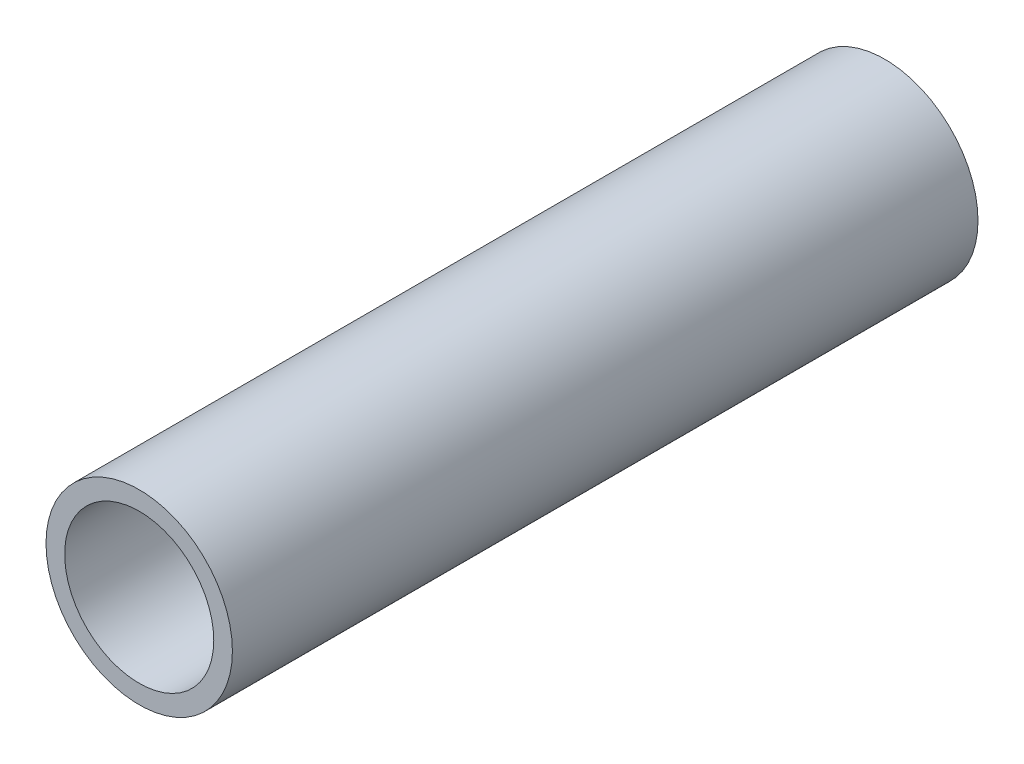
ISO-10303-21;
HEADER;
FILE_DESCRIPTION(('STEP AP214'),'2;1');
FILE_NAME('part.step','',(''),(''),'','','');
FILE_SCHEMA(('AUTOMOTIVE_DESIGN { 1 0 10303 214 1 1 1 1 }'));
ENDSEC;
DATA;
#1=APPLICATION_CONTEXT('core data for automotive mechanical design processes');
#2=APPLICATION_PROTOCOL_DEFINITION('international standard','automotive_design',2000,#1);
#3=PRODUCT_CONTEXT('',#1,'mechanical');
#4=PRODUCT('Part','Part','',(#3));
#5=PRODUCT_RELATED_PRODUCT_CATEGORY('part','',(#4));
#6=PRODUCT_DEFINITION_FORMATION('','',#4);
#7=PRODUCT_DEFINITION_CONTEXT('part definition',#1,'design');
#8=PRODUCT_DEFINITION('design','',#6,#7);
#9=PRODUCT_DEFINITION_SHAPE('','',#8);
#10=(LENGTH_UNIT() NAMED_UNIT(*) SI_UNIT(.MILLI.,.METRE.));
#11=(NAMED_UNIT(*) PLANE_ANGLE_UNIT() SI_UNIT($,.RADIAN.));
#12=(NAMED_UNIT(*) SI_UNIT($,.STERADIAN.) SOLID_ANGLE_UNIT());
#13=UNCERTAINTY_MEASURE_WITH_UNIT(LENGTH_MEASURE(1.E-05),#10,'distance_accuracy_value','');
#14=(GEOMETRIC_REPRESENTATION_CONTEXT(3) GLOBAL_UNCERTAINTY_ASSIGNED_CONTEXT((#13)) GLOBAL_UNIT_ASSIGNED_CONTEXT((#10,
#11,#12)) REPRESENTATION_CONTEXT('',''));
#15=CARTESIAN_POINT('',(0.,0.,0.));
#16=DIRECTION('',(0.,0.,1.));
#17=DIRECTION('',(1.,0.,0.));
#18=AXIS2_PLACEMENT_3D('',#15,#16,#17);
#19=CARTESIAN_POINT('',(0.,0.,200.));
#20=DIRECTION('',(0.,0.,1.));
#21=DIRECTION('',(1.,0.,0.));
#22=AXIS2_PLACEMENT_3D('',#19,#20,#21);
#23=PLANE('',#22);
#24=CARTESIAN_POINT('',(0.,0.,200.));
#25=DIRECTION('',(0.,0.,1.));
#26=DIRECTION('',(1.,0.,0.));
#27=AXIS2_PLACEMENT_3D('',#24,#25,#26);
#28=CIRCLE('',#27,25.);
#29=CARTESIAN_POINT('',(25.,0.,200.));
#30=VERTEX_POINT('',#29);
#31=EDGE_CURVE('E10',#30,#30,#28,.T.);
#32=ORIENTED_EDGE('',*,*,#31,.T.);
#33=EDGE_LOOP('',(#32));
#34=FACE_BOUND('',#33,.T.);
#35=CARTESIAN_POINT('',(0.,0.,200.));
#36=DIRECTION('',(0.,0.,1.));
#37=DIRECTION('',(1.,0.,0.));
#38=AXIS2_PLACEMENT_3D('',#35,#36,#37);
#39=CIRCLE('',#38,20.);
#40=CARTESIAN_POINT('',(20.,0.,200.));
#41=VERTEX_POINT('',#40);
#42=EDGE_CURVE('E50',#41,#41,#39,.T.);
#43=ORIENTED_EDGE('',*,*,#42,.F.);
#44=EDGE_LOOP('',(#43));
#45=FACE_BOUND('',#44,.T.);
#46=ADVANCED_FACE('F37',(#34,#45),#23,.T.);
#47=CARTESIAN_POINT('',(0.,0.,0.));
#48=DIRECTION('',(0.,0.,1.));
#49=DIRECTION('',(1.,0.,0.));
#50=AXIS2_PLACEMENT_3D('',#47,#48,#49);
#51=PLANE('',#50);
#52=CARTESIAN_POINT('',(0.,0.,0.));
#53=DIRECTION('',(0.,0.,1.));
#54=DIRECTION('',(1.,0.,0.));
#55=AXIS2_PLACEMENT_3D('',#52,#53,#54);
#56=CIRCLE('',#55,25.);
#57=CARTESIAN_POINT('',(25.,0.,0.));
#58=VERTEX_POINT('',#57);
#59=EDGE_CURVE('E41',#58,#58,#56,.T.);
#60=ORIENTED_EDGE('',*,*,#59,.F.);
#61=EDGE_LOOP('',(#60));
#62=FACE_BOUND('',#61,.T.);
#63=CARTESIAN_POINT('',(0.,0.,0.));
#64=DIRECTION('',(0.,0.,1.));
#65=DIRECTION('',(1.,0.,0.));
#66=AXIS2_PLACEMENT_3D('',#63,#64,#65);
#67=CIRCLE('',#66,20.);
#68=CARTESIAN_POINT('',(20.,0.,0.));
#69=VERTEX_POINT('',#68);
#70=EDGE_CURVE('E52',#69,#69,#67,.T.);
#71=ORIENTED_EDGE('',*,*,#70,.T.);
#72=EDGE_LOOP('',(#71));
#73=FACE_BOUND('',#72,.T.);
#74=ADVANCED_FACE('F64',(#62,#73),#51,.F.);
#75=CARTESIAN_POINT('',(0.,0.,200.));
#76=DIRECTION('',(0.,0.,-1.));
#77=DIRECTION('',(-1.,0.,0.));
#78=AXIS2_PLACEMENT_3D('',#75,#76,#77);
#79=CYLINDRICAL_SURFACE('',#78,25.);
#80=ORIENTED_EDGE('',*,*,#31,.F.);
#81=EDGE_LOOP('',(#80));
#82=FACE_BOUND('',#81,.T.);
#83=ORIENTED_EDGE('',*,*,#59,.T.);
#84=EDGE_LOOP('',(#83));
#85=FACE_BOUND('',#84,.T.);
#86=ADVANCED_FACE('F39',(#82,#85),#79,.T.);
#87=CARTESIAN_POINT('',(0.,0.,200.));
#88=DIRECTION('',(0.,0.,-1.));
#89=DIRECTION('',(-1.,0.,0.));
#90=AXIS2_PLACEMENT_3D('',#87,#88,#89);
#91=CYLINDRICAL_SURFACE('',#90,20.);
#92=ORIENTED_EDGE('',*,*,#42,.T.);
#93=EDGE_LOOP('',(#92));
#94=FACE_BOUND('',#93,.T.);
#95=ORIENTED_EDGE('',*,*,#70,.F.);
#96=EDGE_LOOP('',(#95));
#97=FACE_BOUND('',#96,.T.);
#98=ADVANCED_FACE('F60',(#94,#97),#91,.F.);
#99=CLOSED_SHELL('',(#46,#74,#86,#98));
#100=MANIFOLD_SOLID_BREP('B2',#99);
#101=ADVANCED_BREP_SHAPE_REPRESENTATION('',(#18,#100),#14);
#102=SHAPE_DEFINITION_REPRESENTATION(#9,#101);
ENDSEC;
END-ISO-10303-21;
